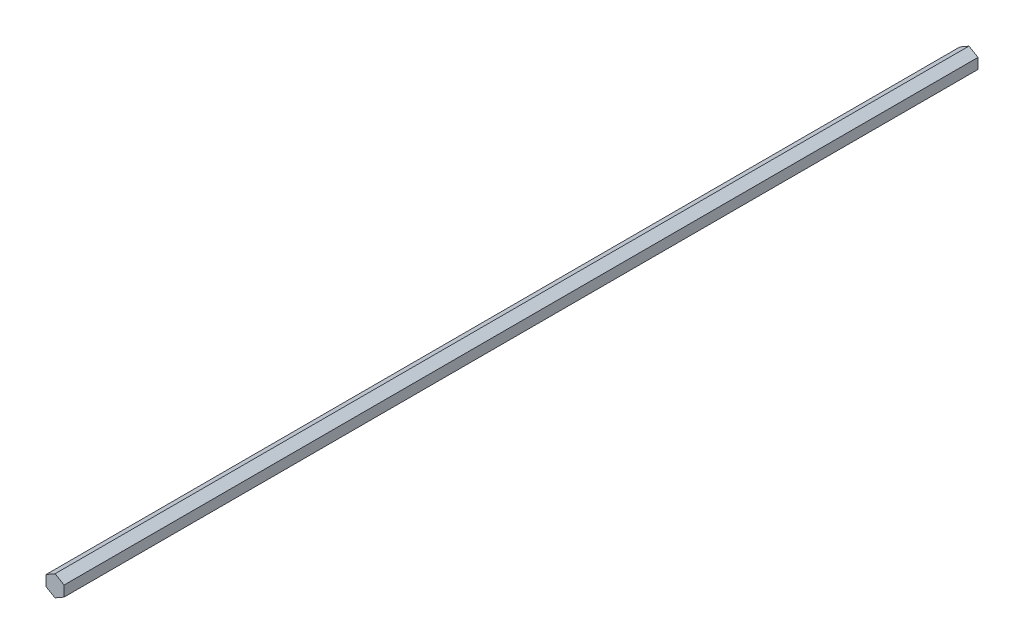
ISO-10303-21;
HEADER;
FILE_DESCRIPTION(('STEP AP214'),'2;1');
FILE_NAME('part.step','',(''),(''),'','','');
FILE_SCHEMA(('AUTOMOTIVE_DESIGN { 1 0 10303 214 1 1 1 1 }'));
ENDSEC;
DATA;
#1=APPLICATION_CONTEXT('core data for automotive mechanical design processes');
#2=APPLICATION_PROTOCOL_DEFINITION('international standard','automotive_design',2000,#1);
#3=PRODUCT_CONTEXT('',#1,'mechanical');
#4=PRODUCT('Part','Part','',(#3));
#5=PRODUCT_RELATED_PRODUCT_CATEGORY('part','',(#4));
#6=PRODUCT_DEFINITION_FORMATION('','',#4);
#7=PRODUCT_DEFINITION_CONTEXT('part definition',#1,'design');
#8=PRODUCT_DEFINITION('design','',#6,#7);
#9=PRODUCT_DEFINITION_SHAPE('','',#8);
#10=(LENGTH_UNIT() NAMED_UNIT(*) SI_UNIT(.MILLI.,.METRE.));
#11=(NAMED_UNIT(*) PLANE_ANGLE_UNIT() SI_UNIT($,.RADIAN.));
#12=(NAMED_UNIT(*) SI_UNIT($,.STERADIAN.) SOLID_ANGLE_UNIT());
#13=UNCERTAINTY_MEASURE_WITH_UNIT(LENGTH_MEASURE(1.E-05),#10,'distance_accuracy_value','');
#14=(GEOMETRIC_REPRESENTATION_CONTEXT(3) GLOBAL_UNCERTAINTY_ASSIGNED_CONTEXT((#13)) GLOBAL_UNIT_ASSIGNED_CONTEXT((#10,
#11,#12)) REPRESENTATION_CONTEXT('',''));
#15=CARTESIAN_POINT('',(0.,0.,0.));
#16=DIRECTION('',(0.,0.,1.));
#17=DIRECTION('',(1.,0.,0.));
#18=AXIS2_PLACEMENT_3D('',#15,#16,#17);
#19=CARTESIAN_POINT('',(6.34999999999996,3.6661742093542,320.15938));
#20=DIRECTION('',(-0.499999999999995,-0.866025403784442,0.));
#21=DIRECTION('',(0.866025403784442,-0.499999999999995,0.));
#22=AXIS2_PLACEMENT_3D('',#19,#20,#21);
#23=PLANE('',#22);
#24=DIRECTION('',(-0.866025403784441,0.499999999999995,0.));
#25=VECTOR('',#24,1.);
#26=CARTESIAN_POINT('',(6.34999999999996,3.6661742093542,-320.15938));
#27=LINE('',#26,#25);
#28=CARTESIAN_POINT('',(6.34999999999996,3.6661742093542,-320.15938));
#29=VERTEX_POINT('',#28);
#30=CARTESIAN_POINT('',(0.,7.33234841870825,-320.15938));
#31=VERTEX_POINT('',#30);
#32=EDGE_CURVE('E132',#29,#31,#27,.T.);
#33=ORIENTED_EDGE('',*,*,#32,.T.);
#34=DIRECTION('',(0.,0.,-1.));
#35=VECTOR('',#34,1.);
#36=CARTESIAN_POINT('',(0.,7.33234841870825,320.15938));
#37=LINE('',#36,#35);
#38=CARTESIAN_POINT('',(0.,7.33234841870825,320.15938));
#39=VERTEX_POINT('',#38);
#40=EDGE_CURVE('E11',#39,#31,#37,.T.);
#41=ORIENTED_EDGE('',*,*,#40,.F.);
#42=DIRECTION('',(-0.866025403784441,0.499999999999995,0.));
#43=VECTOR('',#42,1.);
#44=CARTESIAN_POINT('',(6.34999999999996,3.6661742093542,320.15938));
#45=LINE('',#44,#43);
#46=CARTESIAN_POINT('',(6.34999999999996,3.6661742093542,320.15938));
#47=VERTEX_POINT('',#46);
#48=EDGE_CURVE('E148',#47,#39,#45,.T.);
#49=ORIENTED_EDGE('',*,*,#48,.F.);
#50=DIRECTION('',(0.,0.,-1.));
#51=VECTOR('',#50,1.);
#52=CARTESIAN_POINT('',(6.34999999999996,3.6661742093542,320.15938));
#53=LINE('',#52,#51);
#54=EDGE_CURVE('E128',#47,#29,#53,.T.);
#55=ORIENTED_EDGE('',*,*,#54,.T.);
#56=EDGE_LOOP('',(#33,#41,#49,#55));
#57=FACE_BOUND('',#56,.T.);
#58=ADVANCED_FACE('F43',(#57),#23,.F.);
#59=CARTESIAN_POINT('',(0.,7.33234841870825,320.15938));
#60=DIRECTION('',(0.500000000000001,-0.866025403784438,0.));
#61=DIRECTION('',(0.866025403784438,0.500000000000001,0.));
#62=AXIS2_PLACEMENT_3D('',#59,#60,#61);
#63=PLANE('',#62);
#64=DIRECTION('',(-0.866025403784438,-0.500000000000001,0.));
#65=VECTOR('',#64,1.);
#66=CARTESIAN_POINT('',(0.,7.33234841870825,-320.15938));
#67=LINE('',#66,#65);
#68=CARTESIAN_POINT('',(-6.35000000000001,3.66617420935411,-320.15938));
#69=VERTEX_POINT('',#68);
#70=EDGE_CURVE('E136',#31,#69,#67,.T.);
#71=ORIENTED_EDGE('',*,*,#70,.T.);
#72=DIRECTION('',(0.,0.,-1.));
#73=VECTOR('',#72,1.);
#74=CARTESIAN_POINT('',(-6.35000000000001,3.66617420935411,320.15938));
#75=LINE('',#74,#73);
#76=CARTESIAN_POINT('',(-6.35000000000001,3.66617420935411,320.15938));
#77=VERTEX_POINT('',#76);
#78=EDGE_CURVE('E52',#77,#69,#75,.T.);
#79=ORIENTED_EDGE('',*,*,#78,.F.);
#80=DIRECTION('',(-0.866025403784438,-0.500000000000001,0.));
#81=VECTOR('',#80,1.);
#82=CARTESIAN_POINT('',(0.,7.33234841870825,320.15938));
#83=LINE('',#82,#81);
#84=EDGE_CURVE('E97',#39,#77,#83,.T.);
#85=ORIENTED_EDGE('',*,*,#84,.F.);
#86=ORIENTED_EDGE('',*,*,#40,.T.);
#87=EDGE_LOOP('',(#71,#79,#85,#86));
#88=FACE_BOUND('',#87,.T.);
#89=ADVANCED_FACE('F176',(#88),#63,.F.);
#90=CARTESIAN_POINT('',(-6.35000000000001,3.66617420935411,320.15938));
#91=DIRECTION('',(1.,0.,0.));
#92=DIRECTION('',(0.,1.,0.));
#93=AXIS2_PLACEMENT_3D('',#90,#91,#92);
#94=PLANE('',#93);
#95=DIRECTION('',(0.,-1.,0.));
#96=VECTOR('',#95,1.);
#97=CARTESIAN_POINT('',(-6.35000000000001,3.66617420935411,-320.15938));
#98=LINE('',#97,#96);
#99=CARTESIAN_POINT('',(-6.34999999999998,-3.66617420935415,-320.15938));
#100=VERTEX_POINT('',#99);
#101=EDGE_CURVE('E139',#69,#100,#98,.T.);
#102=ORIENTED_EDGE('',*,*,#101,.T.);
#103=DIRECTION('',(0.,0.,-1.));
#104=VECTOR('',#103,1.);
#105=CARTESIAN_POINT('',(-6.34999999999998,-3.66617420935415,320.15938));
#106=LINE('',#105,#104);
#107=CARTESIAN_POINT('',(-6.34999999999998,-3.66617420935415,320.15938));
#108=VERTEX_POINT('',#107);
#109=EDGE_CURVE('E121',#108,#100,#106,.T.);
#110=ORIENTED_EDGE('',*,*,#109,.F.);
#111=DIRECTION('',(0.,-1.,0.));
#112=VECTOR('',#111,1.);
#113=CARTESIAN_POINT('',(-6.35000000000001,3.66617420935411,320.15938));
#114=LINE('',#113,#112);
#115=EDGE_CURVE('E110',#77,#108,#114,.T.);
#116=ORIENTED_EDGE('',*,*,#115,.F.);
#117=ORIENTED_EDGE('',*,*,#78,.T.);
#118=EDGE_LOOP('',(#102,#110,#116,#117));
#119=FACE_BOUND('',#118,.T.);
#120=ADVANCED_FACE('F158',(#119),#94,.F.);
#121=CARTESIAN_POINT('',(-6.34999999999998,-3.66617420935415,320.15938));
#122=DIRECTION('',(0.499999999999995,0.866025403784442,0.));
#123=DIRECTION('',(-0.866025403784442,0.499999999999995,0.));
#124=AXIS2_PLACEMENT_3D('',#121,#122,#123);
#125=PLANE('',#124);
#126=DIRECTION('',(0.866025403784442,-0.499999999999995,0.));
#127=VECTOR('',#126,1.);
#128=CARTESIAN_POINT('',(-6.34999999999998,-3.66617420935415,-320.15938));
#129=LINE('',#128,#127);
#130=CARTESIAN_POINT('',(0.,-7.33234841870825,-320.15938));
#131=VERTEX_POINT('',#130);
#132=EDGE_CURVE('E119',#100,#131,#129,.T.);
#133=ORIENTED_EDGE('',*,*,#132,.T.);
#134=DIRECTION('',(0.,0.,-1.));
#135=VECTOR('',#134,1.);
#136=CARTESIAN_POINT('',(0.,-7.33234841870825,320.15938));
#137=LINE('',#136,#135);
#138=CARTESIAN_POINT('',(0.,-7.33234841870825,320.15938));
#139=VERTEX_POINT('',#138);
#140=EDGE_CURVE('E116',#139,#131,#137,.T.);
#141=ORIENTED_EDGE('',*,*,#140,.F.);
#142=DIRECTION('',(0.866025403784442,-0.499999999999995,0.));
#143=VECTOR('',#142,1.);
#144=CARTESIAN_POINT('',(-6.34999999999998,-3.66617420935415,320.15938));
#145=LINE('',#144,#143);
#146=EDGE_CURVE('E104',#108,#139,#145,.T.);
#147=ORIENTED_EDGE('',*,*,#146,.F.);
#148=ORIENTED_EDGE('',*,*,#109,.T.);
#149=EDGE_LOOP('',(#133,#141,#147,#148));
#150=FACE_BOUND('',#149,.T.);
#151=ADVANCED_FACE('F117',(#150),#125,.F.);
#152=CARTESIAN_POINT('',(0.,-7.33234841870825,320.15938));
#153=DIRECTION('',(-0.500000000000007,0.866025403784435,0.));
#154=DIRECTION('',(-0.866025403784435,-0.500000000000007,0.));
#155=AXIS2_PLACEMENT_3D('',#152,#153,#154);
#156=PLANE('',#155);
#157=DIRECTION('',(0.866025403784434,0.500000000000007,0.));
#158=VECTOR('',#157,1.);
#159=CARTESIAN_POINT('',(0.,-7.33234841870825,-320.15938));
#160=LINE('',#159,#158);
#161=CARTESIAN_POINT('',(6.35000000000003,-3.66617420935407,-320.15938));
#162=VERTEX_POINT('',#161);
#163=EDGE_CURVE('E83',#131,#162,#160,.T.);
#164=ORIENTED_EDGE('',*,*,#163,.T.);
#165=DIRECTION('',(0.,0.,-1.));
#166=VECTOR('',#165,1.);
#167=CARTESIAN_POINT('',(6.35000000000003,-3.66617420935407,320.15938));
#168=LINE('',#167,#166);
#169=CARTESIAN_POINT('',(6.35000000000003,-3.66617420935407,320.15938));
#170=VERTEX_POINT('',#169);
#171=EDGE_CURVE('E122',#170,#162,#168,.T.);
#172=ORIENTED_EDGE('',*,*,#171,.F.);
#173=DIRECTION('',(0.866025403784434,0.500000000000007,0.));
#174=VECTOR('',#173,1.);
#175=CARTESIAN_POINT('',(0.,-7.33234841870825,320.15938));
#176=LINE('',#175,#174);
#177=EDGE_CURVE('E108',#139,#170,#176,.T.);
#178=ORIENTED_EDGE('',*,*,#177,.F.);
#179=ORIENTED_EDGE('',*,*,#140,.T.);
#180=EDGE_LOOP('',(#164,#172,#178,#179));
#181=FACE_BOUND('',#180,.T.);
#182=ADVANCED_FACE('F124',(#181),#156,.F.);
#183=CARTESIAN_POINT('',(6.35000000000003,-3.66617420935407,320.15938));
#184=DIRECTION('',(-1.,0.,0.));
#185=DIRECTION('',(0.,-1.,0.));
#186=AXIS2_PLACEMENT_3D('',#183,#184,#185);
#187=PLANE('',#186);
#188=DIRECTION('',(0.,1.,0.));
#189=VECTOR('',#188,1.);
#190=CARTESIAN_POINT('',(6.35000000000003,-3.66617420935407,-320.15938));
#191=LINE('',#190,#189);
#192=EDGE_CURVE('E89',#162,#29,#191,.T.);
#193=ORIENTED_EDGE('',*,*,#192,.T.);
#194=ORIENTED_EDGE('',*,*,#54,.F.);
#195=DIRECTION('',(0.,1.,0.));
#196=VECTOR('',#195,1.);
#197=CARTESIAN_POINT('',(6.35000000000003,-3.66617420935407,320.15938));
#198=LINE('',#197,#196);
#199=EDGE_CURVE('E60',#170,#47,#198,.T.);
#200=ORIENTED_EDGE('',*,*,#199,.F.);
#201=ORIENTED_EDGE('',*,*,#171,.T.);
#202=EDGE_LOOP('',(#193,#194,#200,#201));
#203=FACE_BOUND('',#202,.T.);
#204=ADVANCED_FACE('F165',(#203),#187,.F.);
#205=CARTESIAN_POINT('',(0.,0.,320.15938));
#206=DIRECTION('',(0.,0.,1.));
#207=DIRECTION('',(1.,0.,0.));
#208=AXIS2_PLACEMENT_3D('',#205,#206,#207);
#209=PLANE('',#208);
#210=ORIENTED_EDGE('',*,*,#48,.T.);
#211=ORIENTED_EDGE('',*,*,#84,.T.);
#212=ORIENTED_EDGE('',*,*,#115,.T.);
#213=ORIENTED_EDGE('',*,*,#146,.T.);
#214=ORIENTED_EDGE('',*,*,#177,.T.);
#215=ORIENTED_EDGE('',*,*,#199,.T.);
#216=EDGE_LOOP('',(#210,#211,#212,#213,#214,#215));
#217=FACE_BOUND('',#216,.T.);
#218=ADVANCED_FACE('F106',(#217),#209,.T.);
#219=CARTESIAN_POINT('',(0.,0.,-320.15938));
#220=DIRECTION('',(0.,0.,1.));
#221=DIRECTION('',(1.,0.,0.));
#222=AXIS2_PLACEMENT_3D('',#219,#220,#221);
#223=PLANE('',#222);
#224=ORIENTED_EDGE('',*,*,#32,.F.);
#225=ORIENTED_EDGE('',*,*,#192,.F.);
#226=ORIENTED_EDGE('',*,*,#163,.F.);
#227=ORIENTED_EDGE('',*,*,#132,.F.);
#228=ORIENTED_EDGE('',*,*,#101,.F.);
#229=ORIENTED_EDGE('',*,*,#70,.F.);
#230=EDGE_LOOP('',(#224,#225,#226,#227,#228,#229));
#231=FACE_BOUND('',#230,.T.);
#232=ADVANCED_FACE('F161',(#231),#223,.F.);
#233=CLOSED_SHELL('',(#58,#89,#120,#151,#182,#204,#218,#232));
#234=MANIFOLD_SOLID_BREP('B2',#233);
#235=ADVANCED_BREP_SHAPE_REPRESENTATION('',(#18,#234),#14);
#236=SHAPE_DEFINITION_REPRESENTATION(#9,#235);
ENDSEC;
END-ISO-10303-21;
